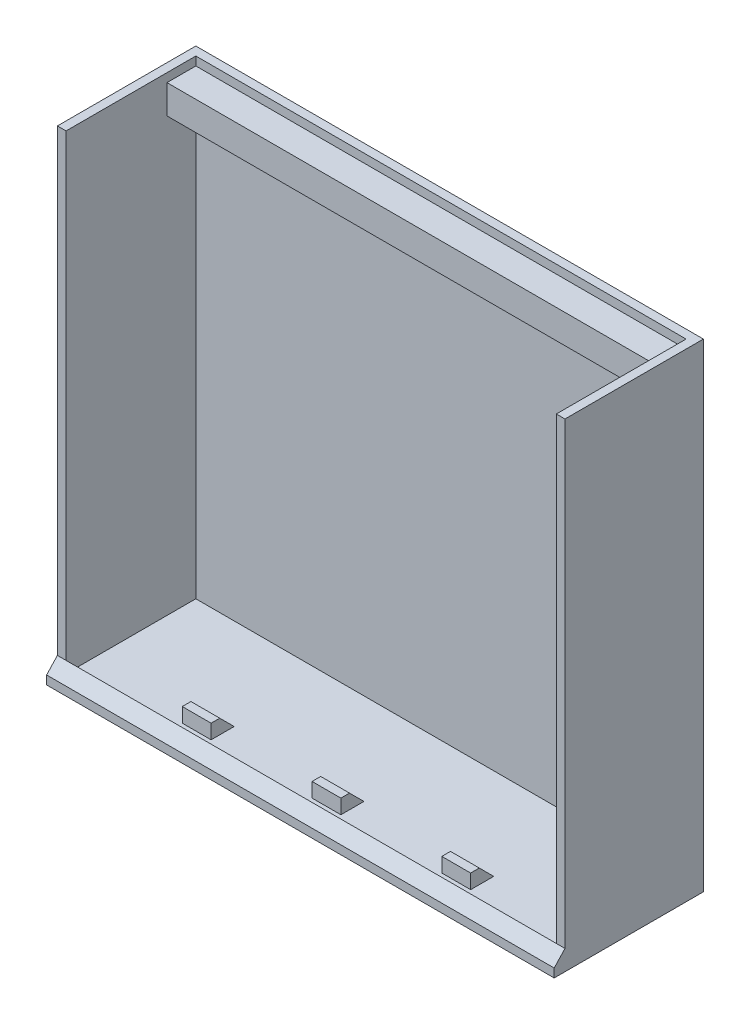
ISO-10303-21;
HEADER;
FILE_DESCRIPTION(('STEP AP214'),'2;1');
FILE_NAME('part.step','',(''),(''),'','','');
FILE_SCHEMA(('AUTOMOTIVE_DESIGN { 1 0 10303 214 1 1 1 1 }'));
ENDSEC;
DATA;
#1=APPLICATION_CONTEXT('core data for automotive mechanical design processes');
#2=APPLICATION_PROTOCOL_DEFINITION('international standard','automotive_design',2000,#1);
#3=PRODUCT_CONTEXT('',#1,'mechanical');
#4=PRODUCT('Part','Part','',(#3));
#5=PRODUCT_RELATED_PRODUCT_CATEGORY('part','',(#4));
#6=PRODUCT_DEFINITION_FORMATION('','',#4);
#7=PRODUCT_DEFINITION_CONTEXT('part definition',#1,'design');
#8=PRODUCT_DEFINITION('design','',#6,#7);
#9=PRODUCT_DEFINITION_SHAPE('','',#8);
#10=(LENGTH_UNIT() NAMED_UNIT(*) SI_UNIT(.MILLI.,.METRE.));
#11=(NAMED_UNIT(*) PLANE_ANGLE_UNIT() SI_UNIT($,.RADIAN.));
#12=(NAMED_UNIT(*) SI_UNIT($,.STERADIAN.) SOLID_ANGLE_UNIT());
#13=UNCERTAINTY_MEASURE_WITH_UNIT(LENGTH_MEASURE(1.E-05),#10,'distance_accuracy_value','');
#14=(GEOMETRIC_REPRESENTATION_CONTEXT(3) GLOBAL_UNCERTAINTY_ASSIGNED_CONTEXT((#13)) GLOBAL_UNIT_ASSIGNED_CONTEXT((#10,
#11,#12)) REPRESENTATION_CONTEXT('',''));
#15=CARTESIAN_POINT('',(0.,0.,0.));
#16=DIRECTION('',(0.,0.,1.));
#17=DIRECTION('',(1.,0.,0.));
#18=AXIS2_PLACEMENT_3D('',#15,#16,#17);
#19=CARTESIAN_POINT('',(-85.,0.,45.));
#20=DIRECTION('',(0.,0.,-1.));
#21=DIRECTION('',(-1.,0.,0.));
#22=AXIS2_PLACEMENT_3D('',#19,#20,#21);
#23=PLANE('',#22);
#24=DIRECTION('',(-1.,0.,0.));
#25=VECTOR('',#24,1.);
#26=CARTESIAN_POINT('',(88.,3.99999999999999,45.));
#27=LINE('',#26,#25);
#28=CARTESIAN_POINT('',(88.,3.99999999999999,45.));
#29=VERTEX_POINT('',#28);
#30=CARTESIAN_POINT('',(85.,3.99999999999999,45.));
#31=VERTEX_POINT('',#30);
#32=EDGE_CURVE('E243',#29,#31,#27,.T.);
#33=ORIENTED_EDGE('',*,*,#32,.F.);
#34=DIRECTION('',(0.,-1.,0.));
#35=VECTOR('',#34,1.);
#36=CARTESIAN_POINT('',(88.,0.,45.));
#37=LINE('',#36,#35);
#38=CARTESIAN_POINT('',(88.,163.,45.));
#39=VERTEX_POINT('',#38);
#40=EDGE_CURVE('E350',#39,#29,#37,.T.);
#41=ORIENTED_EDGE('',*,*,#40,.F.);
#42=DIRECTION('',(-1.,0.,0.));
#43=VECTOR('',#42,1.);
#44=CARTESIAN_POINT('',(88.,163.,45.));
#45=LINE('',#44,#43);
#46=CARTESIAN_POINT('',(85.,163.,45.));
#47=VERTEX_POINT('',#46);
#48=EDGE_CURVE('E356',#39,#47,#45,.T.);
#49=ORIENTED_EDGE('',*,*,#48,.T.);
#50=DIRECTION('',(0.,-1.,0.));
#51=VECTOR('',#50,1.);
#52=CARTESIAN_POINT('',(85.,0.,45.));
#53=LINE('',#52,#51);
#54=EDGE_CURVE('E348',#47,#31,#53,.T.);
#55=ORIENTED_EDGE('',*,*,#54,.T.);
#56=EDGE_LOOP('',(#33,#41,#49,#55));
#57=FACE_BOUND('',#56,.T.);
#58=ADVANCED_FACE('F37',(#57),#23,.F.);
#59=CARTESIAN_POINT('',(-85.,3.99999999999999,45.));
#60=VERTEX_POINT('',#59);
#61=CARTESIAN_POINT('',(-88.,3.99999999999999,45.));
#62=VERTEX_POINT('',#61);
#63=EDGE_CURVE('E220',#60,#62,#27,.T.);
#64=ORIENTED_EDGE('',*,*,#63,.F.);
#65=DIRECTION('',(0.,1.,0.));
#66=VECTOR('',#65,1.);
#67=CARTESIAN_POINT('',(-85.,0.,45.));
#68=LINE('',#67,#66);
#69=CARTESIAN_POINT('',(-85.,163.,45.));
#70=VERTEX_POINT('',#69);
#71=EDGE_CURVE('E372',#60,#70,#68,.T.);
#72=ORIENTED_EDGE('',*,*,#71,.T.);
#73=DIRECTION('',(1.,0.,0.));
#74=VECTOR('',#73,1.);
#75=CARTESIAN_POINT('',(-88.,163.,45.));
#76=LINE('',#75,#74);
#77=CARTESIAN_POINT('',(-88.,163.,45.));
#78=VERTEX_POINT('',#77);
#79=EDGE_CURVE('E223',#78,#70,#76,.T.);
#80=ORIENTED_EDGE('',*,*,#79,.F.);
#81=DIRECTION('',(0.,1.,0.));
#82=VECTOR('',#81,1.);
#83=CARTESIAN_POINT('',(-88.,0.,45.));
#84=LINE('',#83,#82);
#85=EDGE_CURVE('E217',#62,#78,#84,.T.);
#86=ORIENTED_EDGE('',*,*,#85,.F.);
#87=EDGE_LOOP('',(#64,#72,#80,#86));
#88=FACE_BOUND('',#87,.T.);
#89=ADVANCED_FACE('F219',(#88),#23,.F.);
#90=CARTESIAN_POINT('',(-85.,0.,0.));
#91=DIRECTION('',(0.,1.,0.));
#92=DIRECTION('',(0.,0.,1.));
#93=AXIS2_PLACEMENT_3D('',#90,#91,#92);
#94=PLANE('',#93);
#95=DIRECTION('',(1.,0.,0.));
#96=VECTOR('',#95,1.);
#97=CARTESIAN_POINT('',(-85.,0.,45.));
#98=LINE('',#97,#96);
#99=CARTESIAN_POINT('',(-85.,0.,45.));
#100=VERTEX_POINT('',#99);
#101=CARTESIAN_POINT('',(85.,0.,45.));
#102=VERTEX_POINT('',#101);
#103=EDGE_CURVE('E390',#100,#102,#98,.T.);
#104=ORIENTED_EDGE('',*,*,#103,.T.);
#105=DIRECTION('',(0.,0.,1.));
#106=VECTOR('',#105,1.);
#107=CARTESIAN_POINT('',(85.,0.,0.));
#108=LINE('',#107,#106);
#109=CARTESIAN_POINT('',(85.,0.,0.));
#110=VERTEX_POINT('',#109);
#111=EDGE_CURVE('E380',#110,#102,#108,.T.);
#112=ORIENTED_EDGE('',*,*,#111,.F.);
#113=DIRECTION('',(1.,0.,0.));
#114=VECTOR('',#113,1.);
#115=CARTESIAN_POINT('',(-85.,0.,0.));
#116=LINE('',#115,#114);
#117=CARTESIAN_POINT('',(-85.,0.,0.));
#118=VERTEX_POINT('',#117);
#119=EDGE_CURVE('E393',#118,#110,#116,.T.);
#120=ORIENTED_EDGE('',*,*,#119,.F.);
#121=DIRECTION('',(0.,0.,1.));
#122=VECTOR('',#121,1.);
#123=CARTESIAN_POINT('',(-85.,0.,0.));
#124=LINE('',#123,#122);
#125=EDGE_CURVE('E387',#118,#100,#124,.T.);
#126=ORIENTED_EDGE('',*,*,#125,.T.);
#127=EDGE_LOOP('',(#104,#112,#120,#126));
#128=FACE_BOUND('',#127,.T.);
#129=DIRECTION('',(0.,0.,1.));
#130=VECTOR('',#129,1.);
#131=CARTESIAN_POINT('',(-50.,0.,39.7));
#132=LINE('',#131,#130);
#133=CARTESIAN_POINT('',(-50.,0.,31.7));
#134=VERTEX_POINT('',#133);
#135=CARTESIAN_POINT('',(-50.,0.,39.7));
#136=VERTEX_POINT('',#135);
#137=EDGE_CURVE('E315',#134,#136,#132,.T.);
#138=ORIENTED_EDGE('',*,*,#137,.F.);
#139=DIRECTION('',(1.,0.,0.));
#140=VECTOR('',#139,1.);
#141=CARTESIAN_POINT('',(-85.,0.,31.7));
#142=LINE('',#141,#140);
#143=CARTESIAN_POINT('',(-40.,0.,31.7));
#144=VERTEX_POINT('',#143);
#145=EDGE_CURVE('E240',#134,#144,#142,.T.);
#146=ORIENTED_EDGE('',*,*,#145,.T.);
#147=DIRECTION('',(0.,0.,-1.));
#148=VECTOR('',#147,1.);
#149=CARTESIAN_POINT('',(-40.,0.,39.7));
#150=LINE('',#149,#148);
#151=CARTESIAN_POINT('',(-40.,0.,39.7));
#152=VERTEX_POINT('',#151);
#153=EDGE_CURVE('E301',#152,#144,#150,.T.);
#154=ORIENTED_EDGE('',*,*,#153,.F.);
#155=DIRECTION('',(1.,0.,0.));
#156=VECTOR('',#155,1.);
#157=CARTESIAN_POINT('',(-40.,0.,39.7));
#158=LINE('',#157,#156);
#159=EDGE_CURVE('E306',#136,#152,#158,.T.);
#160=ORIENTED_EDGE('',*,*,#159,.F.);
#161=EDGE_LOOP('',(#138,#146,#154,#160));
#162=FACE_BOUND('',#161,.T.);
#163=DIRECTION('',(0.,0.,1.));
#164=VECTOR('',#163,1.);
#165=CARTESIAN_POINT('',(40.,0.,36.7));
#166=LINE('',#165,#164);
#167=CARTESIAN_POINT('',(40.,0.,31.7));
#168=VERTEX_POINT('',#167);
#169=CARTESIAN_POINT('',(40.,0.,39.7));
#170=VERTEX_POINT('',#169);
#171=EDGE_CURVE('E293',#168,#170,#166,.T.);
#172=ORIENTED_EDGE('',*,*,#171,.F.);
#173=DIRECTION('',(1.,0.,0.));
#174=VECTOR('',#173,1.);
#175=CARTESIAN_POINT('',(-85.,0.,31.7));
#176=LINE('',#175,#174);
#177=CARTESIAN_POINT('',(50.,0.,31.7));
#178=VERTEX_POINT('',#177);
#179=EDGE_CURVE('E410',#168,#178,#176,.T.);
#180=ORIENTED_EDGE('',*,*,#179,.T.);
#181=DIRECTION('',(0.,0.,-1.));
#182=VECTOR('',#181,1.);
#183=CARTESIAN_POINT('',(50.,0.,36.7));
#184=LINE('',#183,#182);
#185=CARTESIAN_POINT('',(50.,0.,39.7));
#186=VERTEX_POINT('',#185);
#187=EDGE_CURVE('E279',#186,#178,#184,.T.);
#188=ORIENTED_EDGE('',*,*,#187,.F.);
#189=DIRECTION('',(1.,0.,0.));
#190=VECTOR('',#189,1.);
#191=CARTESIAN_POINT('',(50.,0.,39.7));
#192=LINE('',#191,#190);
#193=EDGE_CURVE('E284',#170,#186,#192,.T.);
#194=ORIENTED_EDGE('',*,*,#193,.F.);
#195=EDGE_LOOP('',(#172,#180,#188,#194));
#196=FACE_BOUND('',#195,.T.);
#197=DIRECTION('',(0.,0.,1.));
#198=VECTOR('',#197,1.);
#199=CARTESIAN_POINT('',(-5.,0.,39.7));
#200=LINE('',#199,#198);
#201=CARTESIAN_POINT('',(-5.,0.,31.7));
#202=VERTEX_POINT('',#201);
#203=CARTESIAN_POINT('',(-5.,0.,39.7));
#204=VERTEX_POINT('',#203);
#205=EDGE_CURVE('E53',#202,#204,#200,.T.);
#206=ORIENTED_EDGE('',*,*,#205,.F.);
#207=DIRECTION('',(1.,0.,0.));
#208=VECTOR('',#207,1.);
#209=CARTESIAN_POINT('',(-85.,0.,31.7));
#210=LINE('',#209,#208);
#211=CARTESIAN_POINT('',(5.,0.,31.7));
#212=VERTEX_POINT('',#211);
#213=EDGE_CURVE('E413',#202,#212,#210,.T.);
#214=ORIENTED_EDGE('',*,*,#213,.T.);
#215=DIRECTION('',(0.,0.,-1.));
#216=VECTOR('',#215,1.);
#217=CARTESIAN_POINT('',(5.,0.,39.7));
#218=LINE('',#217,#216);
#219=CARTESIAN_POINT('',(5.,0.,39.7));
#220=VERTEX_POINT('',#219);
#221=EDGE_CURVE('E61',#220,#212,#218,.T.);
#222=ORIENTED_EDGE('',*,*,#221,.F.);
#223=DIRECTION('',(1.,0.,0.));
#224=VECTOR('',#223,1.);
#225=CARTESIAN_POINT('',(5.,0.,39.7));
#226=LINE('',#225,#224);
#227=EDGE_CURVE('E265',#204,#220,#226,.T.);
#228=ORIENTED_EDGE('',*,*,#227,.F.);
#229=EDGE_LOOP('',(#206,#214,#222,#228));
#230=FACE_BOUND('',#229,.T.);
#231=ADVANCED_FACE('F435',(#128,#162,#196,#230),#94,.T.);
#232=CARTESIAN_POINT('',(-85.,0.,0.));
#233=DIRECTION('',(0.,0.,-1.));
#234=DIRECTION('',(-1.,0.,0.));
#235=AXIS2_PLACEMENT_3D('',#232,#233,#234);
#236=PLANE('',#235);
#237=DIRECTION('',(-1.,0.,0.));
#238=VECTOR('',#237,1.);
#239=CARTESIAN_POINT('',(88.,160.,0.));
#240=LINE('',#239,#238);
#241=CARTESIAN_POINT('',(85.,160.,0.));
#242=VERTEX_POINT('',#241);
#243=CARTESIAN_POINT('',(-85.,160.,0.));
#244=VERTEX_POINT('',#243);
#245=EDGE_CURVE('E323',#242,#244,#240,.T.);
#246=ORIENTED_EDGE('',*,*,#245,.F.);
#247=DIRECTION('',(0.,1.,0.));
#248=VECTOR('',#247,1.);
#249=CARTESIAN_POINT('',(85.,0.,0.));
#250=LINE('',#249,#248);
#251=CARTESIAN_POINT('',(85.,163.,0.));
#252=VERTEX_POINT('',#251);
#253=EDGE_CURVE('E376',#242,#252,#250,.T.);
#254=ORIENTED_EDGE('',*,*,#253,.T.);
#255=DIRECTION('',(1.,0.,0.));
#256=VECTOR('',#255,1.);
#257=CARTESIAN_POINT('',(-85.,163.,0.));
#258=LINE('',#257,#256);
#259=CARTESIAN_POINT('',(-85.,163.,0.));
#260=VERTEX_POINT('',#259);
#261=EDGE_CURVE('E395',#260,#252,#258,.T.);
#262=ORIENTED_EDGE('',*,*,#261,.F.);
#263=DIRECTION('',(0.,1.,0.));
#264=VECTOR('',#263,1.);
#265=CARTESIAN_POINT('',(-85.,0.,0.));
#266=LINE('',#265,#264);
#267=EDGE_CURVE('E383',#244,#260,#266,.T.);
#268=ORIENTED_EDGE('',*,*,#267,.F.);
#269=EDGE_LOOP('',(#246,#254,#262,#268));
#270=FACE_BOUND('',#269,.T.);
#271=ADVANCED_FACE('F576',(#270),#236,.F.);
#272=DIRECTION('',(-1.,0.,0.));
#273=VECTOR('',#272,1.);
#274=CARTESIAN_POINT('',(88.,140.,0.));
#275=LINE('',#274,#273);
#276=CARTESIAN_POINT('',(85.,140.,0.));
#277=VERTEX_POINT('',#276);
#278=CARTESIAN_POINT('',(-85.,140.,0.));
#279=VERTEX_POINT('',#278);
#280=EDGE_CURVE('E326',#277,#279,#275,.T.);
#281=ORIENTED_EDGE('',*,*,#280,.T.);
#282=EDGE_CURVE('E384',#118,#279,#266,.T.);
#283=ORIENTED_EDGE('',*,*,#282,.F.);
#284=ORIENTED_EDGE('',*,*,#119,.T.);
#285=EDGE_CURVE('E377',#110,#277,#250,.T.);
#286=ORIENTED_EDGE('',*,*,#285,.T.);
#287=EDGE_LOOP('',(#281,#283,#284,#286));
#288=FACE_BOUND('',#287,.T.);
#289=ADVANCED_FACE('F575',(#288),#236,.F.);
#290=CARTESIAN_POINT('',(-85.,0.,0.));
#291=DIRECTION('',(-1.,0.,0.));
#292=DIRECTION('',(0.,0.,1.));
#293=AXIS2_PLACEMENT_3D('',#290,#291,#292);
#294=PLANE('',#293);
#295=DIRECTION('',(0.,0.,1.));
#296=VECTOR('',#295,1.);
#297=CARTESIAN_POINT('',(-85.,160.,-4.44089209850063E-13));
#298=LINE('',#297,#296);
#299=CARTESIAN_POINT('',(-85.,160.,10.));
#300=VERTEX_POINT('',#299);
#301=EDGE_CURVE('E340',#244,#300,#298,.T.);
#302=ORIENTED_EDGE('',*,*,#301,.F.);
#303=ORIENTED_EDGE('',*,*,#267,.T.);
#304=DIRECTION('',(0.,0.,1.));
#305=VECTOR('',#304,1.);
#306=CARTESIAN_POINT('',(-85.,163.,0.));
#307=LINE('',#306,#305);
#308=EDGE_CURVE('E363',#260,#70,#307,.T.);
#309=ORIENTED_EDGE('',*,*,#308,.T.);
#310=ORIENTED_EDGE('',*,*,#71,.F.);
#311=EDGE_CURVE('E364',#100,#60,#68,.T.);
#312=ORIENTED_EDGE('',*,*,#311,.F.);
#313=ORIENTED_EDGE('',*,*,#125,.F.);
#314=ORIENTED_EDGE('',*,*,#282,.T.);
#315=DIRECTION('',(0.,-0.707106781186548,-0.707106781186547));
#316=VECTOR('',#315,1.);
#317=CARTESIAN_POINT('',(-85.,69.9999999999999,-70.));
#318=LINE('',#317,#316);
#319=CARTESIAN_POINT('',(-85.,150.,9.99999999999999));
#320=VERTEX_POINT('',#319);
#321=EDGE_CURVE('E334',#320,#279,#318,.T.);
#322=ORIENTED_EDGE('',*,*,#321,.F.);
#323=DIRECTION('',(0.,-1.,0.));
#324=VECTOR('',#323,1.);
#325=CARTESIAN_POINT('',(-85.,0.,9.99999999999997));
#326=LINE('',#325,#324);
#327=EDGE_CURVE('E337',#300,#320,#326,.T.);
#328=ORIENTED_EDGE('',*,*,#327,.F.);
#329=EDGE_LOOP('',(#302,#303,#309,#310,#312,#313,#314,#322,#328));
#330=FACE_BOUND('',#329,.T.);
#331=ADVANCED_FACE('F548',(#330),#294,.F.);
#332=CARTESIAN_POINT('',(85.,0.,0.));
#333=DIRECTION('',(1.,0.,0.));
#334=DIRECTION('',(0.,0.,-1.));
#335=AXIS2_PLACEMENT_3D('',#332,#333,#334);
#336=PLANE('',#335);
#337=DIRECTION('',(0.,0.,-1.));
#338=VECTOR('',#337,1.);
#339=CARTESIAN_POINT('',(85.,160.,-4.44089209850063E-13));
#340=LINE('',#339,#338);
#341=CARTESIAN_POINT('',(85.,160.,10.));
#342=VERTEX_POINT('',#341);
#343=EDGE_CURVE('E241',#342,#242,#340,.T.);
#344=ORIENTED_EDGE('',*,*,#343,.F.);
#345=DIRECTION('',(0.,1.,0.));
#346=VECTOR('',#345,1.);
#347=CARTESIAN_POINT('',(85.,0.,9.99999999999997));
#348=LINE('',#347,#346);
#349=CARTESIAN_POINT('',(85.,150.,10.));
#350=VERTEX_POINT('',#349);
#351=EDGE_CURVE('E403',#350,#342,#348,.T.);
#352=ORIENTED_EDGE('',*,*,#351,.F.);
#353=DIRECTION('',(0.,0.707106781186548,0.707106781186547));
#354=VECTOR('',#353,1.);
#355=CARTESIAN_POINT('',(85.,69.9999999999999,-70.));
#356=LINE('',#355,#354);
#357=EDGE_CURVE('E392',#277,#350,#356,.T.);
#358=ORIENTED_EDGE('',*,*,#357,.F.);
#359=ORIENTED_EDGE('',*,*,#285,.F.);
#360=ORIENTED_EDGE('',*,*,#111,.T.);
#361=EDGE_CURVE('E358',#31,#102,#53,.T.);
#362=ORIENTED_EDGE('',*,*,#361,.F.);
#363=ORIENTED_EDGE('',*,*,#54,.F.);
#364=DIRECTION('',(0.,0.,1.));
#365=VECTOR('',#364,1.);
#366=CARTESIAN_POINT('',(85.,163.,0.));
#367=LINE('',#366,#365);
#368=EDGE_CURVE('E343',#252,#47,#367,.T.);
#369=ORIENTED_EDGE('',*,*,#368,.F.);
#370=ORIENTED_EDGE('',*,*,#253,.F.);
#371=EDGE_LOOP('',(#344,#352,#358,#359,#360,#362,#363,#369,#370));
#372=FACE_BOUND('',#371,.T.);
#373=ADVANCED_FACE('F561',(#372),#336,.F.);
#374=CARTESIAN_POINT('',(-85.,163.,0.));
#375=DIRECTION('',(0.,-1.,0.));
#376=DIRECTION('',(0.,0.,-1.));
#377=AXIS2_PLACEMENT_3D('',#374,#375,#376);
#378=PLANE('',#377);
#379=ORIENTED_EDGE('',*,*,#261,.T.);
#380=ORIENTED_EDGE('',*,*,#368,.T.);
#381=ORIENTED_EDGE('',*,*,#48,.F.);
#382=DIRECTION('',(0.,0.,1.));
#383=VECTOR('',#382,1.);
#384=CARTESIAN_POINT('',(88.,163.,0.));
#385=LINE('',#384,#383);
#386=CARTESIAN_POINT('',(88.,163.,-3.));
#387=VERTEX_POINT('',#386);
#388=EDGE_CURVE('E347',#387,#39,#385,.T.);
#389=ORIENTED_EDGE('',*,*,#388,.F.);
#390=DIRECTION('',(1.,0.,0.));
#391=VECTOR('',#390,1.);
#392=CARTESIAN_POINT('',(-85.,163.,-3.));
#393=LINE('',#392,#391);
#394=CARTESIAN_POINT('',(-88.,163.,-3.));
#395=VERTEX_POINT('',#394);
#396=EDGE_CURVE('E398',#395,#387,#393,.T.);
#397=ORIENTED_EDGE('',*,*,#396,.F.);
#398=DIRECTION('',(0.,0.,1.));
#399=VECTOR('',#398,1.);
#400=CARTESIAN_POINT('',(-88.,163.,0.));
#401=LINE('',#400,#399);
#402=EDGE_CURVE('E229',#395,#78,#401,.T.);
#403=ORIENTED_EDGE('',*,*,#402,.T.);
#404=ORIENTED_EDGE('',*,*,#79,.T.);
#405=ORIENTED_EDGE('',*,*,#308,.F.);
#406=EDGE_LOOP('',(#379,#380,#381,#389,#397,#403,#404,#405));
#407=FACE_BOUND('',#406,.T.);
#408=ADVANCED_FACE('F553',(#407),#378,.F.);
#409=CARTESIAN_POINT('',(-85.,0.,-3.00000000000002));
#410=DIRECTION('',(0.,0.,1.));
#411=DIRECTION('',(0.,-1.,0.));
#412=AXIS2_PLACEMENT_3D('',#409,#410,#411);
#413=PLANE('',#412);
#414=ORIENTED_EDGE('',*,*,#396,.T.);
#415=DIRECTION('',(0.,1.,0.));
#416=VECTOR('',#415,1.);
#417=CARTESIAN_POINT('',(88.,0.,-3.00000000000002));
#418=LINE('',#417,#416);
#419=CARTESIAN_POINT('',(88.,-3.,-3.00000000000002));
#420=VERTEX_POINT('',#419);
#421=EDGE_CURVE('E344',#420,#387,#418,.T.);
#422=ORIENTED_EDGE('',*,*,#421,.F.);
#423=DIRECTION('',(1.,0.,0.));
#424=VECTOR('',#423,1.);
#425=CARTESIAN_POINT('',(-85.,-3.,-3.00000000000002));
#426=LINE('',#425,#424);
#427=CARTESIAN_POINT('',(-88.,-3.,-3.00000000000002));
#428=VERTEX_POINT('',#427);
#429=EDGE_CURVE('E389',#428,#420,#426,.T.);
#430=ORIENTED_EDGE('',*,*,#429,.F.);
#431=DIRECTION('',(0.,-1.,0.));
#432=VECTOR('',#431,1.);
#433=CARTESIAN_POINT('',(-88.,0.,-3.00000000000002));
#434=LINE('',#433,#432);
#435=EDGE_CURVE('E367',#395,#428,#434,.T.);
#436=ORIENTED_EDGE('',*,*,#435,.F.);
#437=EDGE_LOOP('',(#414,#422,#430,#436));
#438=FACE_BOUND('',#437,.T.);
#439=ADVANCED_FACE('F559',(#438),#413,.F.);
#440=CARTESIAN_POINT('',(-85.,-3.,0.));
#441=DIRECTION('',(0.,1.,0.));
#442=DIRECTION('',(0.,0.,1.));
#443=AXIS2_PLACEMENT_3D('',#440,#441,#442);
#444=PLANE('',#443);
#445=ORIENTED_EDGE('',*,*,#429,.T.);
#446=DIRECTION('',(0.,0.,-1.));
#447=VECTOR('',#446,1.);
#448=CARTESIAN_POINT('',(88.,-3.,0.));
#449=LINE('',#448,#447);
#450=CARTESIAN_POINT('',(88.,-3.00000000000001,48.7425732673633));
#451=VERTEX_POINT('',#450);
#452=EDGE_CURVE('E353',#451,#420,#449,.T.);
#453=ORIENTED_EDGE('',*,*,#452,.F.);
#454=DIRECTION('',(-1.,0.,0.));
#455=VECTOR('',#454,1.);
#456=CARTESIAN_POINT('',(88.,-3.00000000000001,48.7425732673633));
#457=LINE('',#456,#455);
#458=CARTESIAN_POINT('',(-88.,-3.00000000000001,48.7425732673633));
#459=VERTEX_POINT('',#458);
#460=EDGE_CURVE('E256',#451,#459,#457,.T.);
#461=ORIENTED_EDGE('',*,*,#460,.T.);
#462=DIRECTION('',(0.,0.,1.));
#463=VECTOR('',#462,1.);
#464=CARTESIAN_POINT('',(-88.,-3.,0.));
#465=LINE('',#464,#463);
#466=EDGE_CURVE('E228',#428,#459,#465,.T.);
#467=ORIENTED_EDGE('',*,*,#466,.F.);
#468=EDGE_LOOP('',(#445,#453,#461,#467));
#469=FACE_BOUND('',#468,.T.);
#470=ADVANCED_FACE('F465',(#469),#444,.F.);
#471=CARTESIAN_POINT('',(-88.,0.,0.));
#472=DIRECTION('',(-1.,0.,0.));
#473=DIRECTION('',(0.,0.,1.));
#474=AXIS2_PLACEMENT_3D('',#471,#472,#473);
#475=PLANE('',#474);
#476=ORIENTED_EDGE('',*,*,#402,.F.);
#477=ORIENTED_EDGE('',*,*,#435,.T.);
#478=ORIENTED_EDGE('',*,*,#466,.T.);
#479=DIRECTION('',(0.,-1.,0.));
#480=VECTOR('',#479,1.);
#481=CARTESIAN_POINT('',(-88.,-3.00000000000001,48.7425732673633));
#482=LINE('',#481,#480);
#483=CARTESIAN_POINT('',(-88.,0.,48.7425732673633));
#484=VERTEX_POINT('',#483);
#485=EDGE_CURVE('E247',#484,#459,#482,.T.);
#486=ORIENTED_EDGE('',*,*,#485,.F.);
#487=DIRECTION('',(0.,-0.730213325351157,0.683219217732936));
#488=VECTOR('',#487,1.);
#489=CARTESIAN_POINT('',(-88.,0.,48.7425732673633));
#490=LINE('',#489,#488);
#491=EDGE_CURVE('E237',#62,#484,#490,.T.);
#492=ORIENTED_EDGE('',*,*,#491,.F.);
#493=ORIENTED_EDGE('',*,*,#85,.T.);
#494=EDGE_LOOP('',(#476,#477,#478,#486,#492,#493));
#495=FACE_BOUND('',#494,.T.);
#496=ADVANCED_FACE('F245',(#495),#475,.T.);
#497=CARTESIAN_POINT('',(88.,0.,0.));
#498=DIRECTION('',(1.,0.,0.));
#499=DIRECTION('',(0.,0.,-1.));
#500=AXIS2_PLACEMENT_3D('',#497,#498,#499);
#501=PLANE('',#500);
#502=ORIENTED_EDGE('',*,*,#421,.T.);
#503=ORIENTED_EDGE('',*,*,#388,.T.);
#504=ORIENTED_EDGE('',*,*,#40,.T.);
#505=DIRECTION('',(0.,-0.730213325351157,0.683219217732936));
#506=VECTOR('',#505,1.);
#507=CARTESIAN_POINT('',(88.,0.,48.7425732673633));
#508=LINE('',#507,#506);
#509=CARTESIAN_POINT('',(88.,0.,48.7425732673633));
#510=VERTEX_POINT('',#509);
#511=EDGE_CURVE('E249',#29,#510,#508,.T.);
#512=ORIENTED_EDGE('',*,*,#511,.T.);
#513=DIRECTION('',(0.,-1.,0.));
#514=VECTOR('',#513,1.);
#515=CARTESIAN_POINT('',(88.,-3.00000000000001,48.7425732673633));
#516=LINE('',#515,#514);
#517=EDGE_CURVE('E253',#510,#451,#516,.T.);
#518=ORIENTED_EDGE('',*,*,#517,.T.);
#519=ORIENTED_EDGE('',*,*,#452,.T.);
#520=EDGE_LOOP('',(#502,#503,#504,#512,#518,#519));
#521=FACE_BOUND('',#520,.T.);
#522=ADVANCED_FACE('F536',(#521),#501,.T.);
#523=CARTESIAN_POINT('',(88.,160.,10.));
#524=DIRECTION('',(0.,-1.,0.));
#525=DIRECTION('',(0.,0.,-1.));
#526=AXIS2_PLACEMENT_3D('',#523,#524,#525);
#527=PLANE('',#526);
#528=ORIENTED_EDGE('',*,*,#245,.T.);
#529=ORIENTED_EDGE('',*,*,#301,.T.);
#530=DIRECTION('',(-1.,0.,0.));
#531=VECTOR('',#530,1.);
#532=CARTESIAN_POINT('',(88.,160.,10.));
#533=LINE('',#532,#531);
#534=EDGE_CURVE('E331',#342,#300,#533,.T.);
#535=ORIENTED_EDGE('',*,*,#534,.F.);
#536=ORIENTED_EDGE('',*,*,#343,.T.);
#537=EDGE_LOOP('',(#528,#529,#535,#536));
#538=FACE_BOUND('',#537,.T.);
#539=ADVANCED_FACE('F565',(#538),#527,.F.);
#540=CARTESIAN_POINT('',(88.,160.,10.));
#541=DIRECTION('',(0.,0.,-1.));
#542=DIRECTION('',(0.,1.,0.));
#543=AXIS2_PLACEMENT_3D('',#540,#541,#542);
#544=PLANE('',#543);
#545=ORIENTED_EDGE('',*,*,#534,.T.);
#546=ORIENTED_EDGE('',*,*,#327,.T.);
#547=DIRECTION('',(-1.,0.,0.));
#548=VECTOR('',#547,1.);
#549=CARTESIAN_POINT('',(88.,150.,10.));
#550=LINE('',#549,#548);
#551=EDGE_CURVE('E328',#350,#320,#550,.T.);
#552=ORIENTED_EDGE('',*,*,#551,.F.);
#553=ORIENTED_EDGE('',*,*,#351,.T.);
#554=EDGE_LOOP('',(#545,#546,#552,#553));
#555=FACE_BOUND('',#554,.T.);
#556=ADVANCED_FACE('F567',(#555),#544,.F.);
#557=CARTESIAN_POINT('',(88.,150.,10.));
#558=DIRECTION('',(0.,0.707106781186547,-0.707106781186548));
#559=DIRECTION('',(0.,0.707106781186548,0.707106781186547));
#560=AXIS2_PLACEMENT_3D('',#557,#558,#559);
#561=PLANE('',#560);
#562=ORIENTED_EDGE('',*,*,#551,.T.);
#563=ORIENTED_EDGE('',*,*,#321,.T.);
#564=ORIENTED_EDGE('',*,*,#280,.F.);
#565=ORIENTED_EDGE('',*,*,#357,.T.);
#566=EDGE_LOOP('',(#562,#563,#564,#565));
#567=FACE_BOUND('',#566,.T.);
#568=ADVANCED_FACE('F572',(#567),#561,.F.);
#569=CARTESIAN_POINT('',(-40.,4.99999999999999,39.7));
#570=DIRECTION('',(-1.,0.,0.));
#571=DIRECTION('',(0.,0.,1.));
#572=AXIS2_PLACEMENT_3D('',#569,#570,#571);
#573=PLANE('',#572);
#574=ORIENTED_EDGE('',*,*,#153,.T.);
#575=DIRECTION('',(0.,0.707106781186549,0.707106781186546));
#576=VECTOR('',#575,1.);
#577=CARTESIAN_POINT('',(-40.,6.5,38.2));
#578=LINE('',#577,#576);
#579=CARTESIAN_POINT('',(-40.,4.99999999999999,36.7));
#580=VERTEX_POINT('',#579);
#581=EDGE_CURVE('E11',#144,#580,#578,.T.);
#582=ORIENTED_EDGE('',*,*,#581,.T.);
#583=DIRECTION('',(0.,0.,-1.));
#584=VECTOR('',#583,1.);
#585=CARTESIAN_POINT('',(-40.,4.99999999999999,39.7));
#586=LINE('',#585,#584);
#587=CARTESIAN_POINT('',(-40.,4.99999999999999,39.7));
#588=VERTEX_POINT('',#587);
#589=EDGE_CURVE('E302',#588,#580,#586,.T.);
#590=ORIENTED_EDGE('',*,*,#589,.F.);
#591=DIRECTION('',(0.,-1.,0.));
#592=VECTOR('',#591,1.);
#593=CARTESIAN_POINT('',(-40.,4.99999999999999,39.7));
#594=LINE('',#593,#592);
#595=EDGE_CURVE('E313',#588,#152,#594,.T.);
#596=ORIENTED_EDGE('',*,*,#595,.T.);
#597=EDGE_LOOP('',(#574,#582,#590,#596));
#598=FACE_BOUND('',#597,.T.);
#599=ADVANCED_FACE('F443',(#598),#573,.F.);
#600=CARTESIAN_POINT('',(-50.,4.99999999999999,39.7));
#601=DIRECTION('',(1.,0.,0.));
#602=DIRECTION('',(0.,0.,-1.));
#603=AXIS2_PLACEMENT_3D('',#600,#601,#602);
#604=PLANE('',#603);
#605=ORIENTED_EDGE('',*,*,#137,.T.);
#606=DIRECTION('',(0.,-1.,0.));
#607=VECTOR('',#606,1.);
#608=CARTESIAN_POINT('',(-50.,4.99999999999999,39.7));
#609=LINE('',#608,#607);
#610=CARTESIAN_POINT('',(-50.,4.99999999999999,39.7));
#611=VERTEX_POINT('',#610);
#612=EDGE_CURVE('E321',#611,#136,#609,.T.);
#613=ORIENTED_EDGE('',*,*,#612,.F.);
#614=DIRECTION('',(0.,0.,1.));
#615=VECTOR('',#614,1.);
#616=CARTESIAN_POINT('',(-50.,4.99999999999999,39.7));
#617=LINE('',#616,#615);
#618=CARTESIAN_POINT('',(-50.,4.99999999999999,36.7));
#619=VERTEX_POINT('',#618);
#620=EDGE_CURVE('E309',#619,#611,#617,.T.);
#621=ORIENTED_EDGE('',*,*,#620,.F.);
#622=DIRECTION('',(0.,-0.707106781186549,-0.707106781186546));
#623=VECTOR('',#622,1.);
#624=CARTESIAN_POINT('',(-50.,6.5,38.2));
#625=LINE('',#624,#623);
#626=EDGE_CURVE('E46',#619,#134,#625,.T.);
#627=ORIENTED_EDGE('',*,*,#626,.T.);
#628=EDGE_LOOP('',(#605,#613,#621,#627));
#629=FACE_BOUND('',#628,.T.);
#630=ADVANCED_FACE('F427',(#629),#604,.F.);
#631=CARTESIAN_POINT('',(-40.,4.99999999999999,39.7));
#632=DIRECTION('',(0.,0.,-1.));
#633=DIRECTION('',(0.,1.,0.));
#634=AXIS2_PLACEMENT_3D('',#631,#632,#633);
#635=PLANE('',#634);
#636=ORIENTED_EDGE('',*,*,#159,.T.);
#637=ORIENTED_EDGE('',*,*,#595,.F.);
#638=DIRECTION('',(1.,0.,0.));
#639=VECTOR('',#638,1.);
#640=CARTESIAN_POINT('',(-40.,4.99999999999999,39.7));
#641=LINE('',#640,#639);
#642=EDGE_CURVE('E311',#611,#588,#641,.T.);
#643=ORIENTED_EDGE('',*,*,#642,.F.);
#644=ORIENTED_EDGE('',*,*,#612,.T.);
#645=EDGE_LOOP('',(#636,#637,#643,#644));
#646=FACE_BOUND('',#645,.T.);
#647=ADVANCED_FACE('F439',(#646),#635,.F.);
#648=CARTESIAN_POINT('',(0.,5.,0.));
#649=DIRECTION('',(0.,1.,0.));
#650=DIRECTION('',(0.,0.,1.));
#651=AXIS2_PLACEMENT_3D('',#648,#649,#650);
#652=PLANE('',#651);
#653=ORIENTED_EDGE('',*,*,#589,.T.);
#654=DIRECTION('',(-1.,0.,0.));
#655=VECTOR('',#654,1.);
#656=CARTESIAN_POINT('',(-40.,4.99999999999999,36.7));
#657=LINE('',#656,#655);
#658=EDGE_CURVE('E305',#580,#619,#657,.T.);
#659=ORIENTED_EDGE('',*,*,#658,.T.);
#660=ORIENTED_EDGE('',*,*,#620,.T.);
#661=ORIENTED_EDGE('',*,*,#642,.T.);
#662=EDGE_LOOP('',(#653,#659,#660,#661));
#663=FACE_BOUND('',#662,.T.);
#664=ADVANCED_FACE('F445',(#663),#652,.T.);
#665=CARTESIAN_POINT('',(50.,4.99999999999999,36.7));
#666=DIRECTION('',(-1.,0.,0.));
#667=DIRECTION('',(0.,0.,1.));
#668=AXIS2_PLACEMENT_3D('',#665,#666,#667);
#669=PLANE('',#668);
#670=ORIENTED_EDGE('',*,*,#187,.T.);
#671=DIRECTION('',(0.,0.707106781186549,0.707106781186546));
#672=VECTOR('',#671,1.);
#673=CARTESIAN_POINT('',(50.,4.99999999999999,36.7));
#674=LINE('',#673,#672);
#675=CARTESIAN_POINT('',(50.,4.99999999999999,36.7));
#676=VERTEX_POINT('',#675);
#677=EDGE_CURVE('E422',#178,#676,#674,.T.);
#678=ORIENTED_EDGE('',*,*,#677,.T.);
#679=DIRECTION('',(0.,0.,-1.));
#680=VECTOR('',#679,1.);
#681=CARTESIAN_POINT('',(50.,4.99999999999999,36.7));
#682=LINE('',#681,#680);
#683=CARTESIAN_POINT('',(50.,4.99999999999999,39.7));
#684=VERTEX_POINT('',#683);
#685=EDGE_CURVE('E280',#684,#676,#682,.T.);
#686=ORIENTED_EDGE('',*,*,#685,.F.);
#687=DIRECTION('',(0.,-1.,0.));
#688=VECTOR('',#687,1.);
#689=CARTESIAN_POINT('',(50.,4.99999999999999,39.7));
#690=LINE('',#689,#688);
#691=EDGE_CURVE('E291',#684,#186,#690,.T.);
#692=ORIENTED_EDGE('',*,*,#691,.T.);
#693=EDGE_LOOP('',(#670,#678,#686,#692));
#694=FACE_BOUND('',#693,.T.);
#695=ADVANCED_FACE('F447',(#694),#669,.F.);
#696=CARTESIAN_POINT('',(40.,4.99999999999999,36.7));
#697=DIRECTION('',(1.,0.,0.));
#698=DIRECTION('',(0.,0.,-1.));
#699=AXIS2_PLACEMENT_3D('',#696,#697,#698);
#700=PLANE('',#699);
#701=ORIENTED_EDGE('',*,*,#171,.T.);
#702=DIRECTION('',(0.,-1.,0.));
#703=VECTOR('',#702,1.);
#704=CARTESIAN_POINT('',(40.,4.99999999999999,39.7));
#705=LINE('',#704,#703);
#706=CARTESIAN_POINT('',(40.,4.99999999999999,39.7));
#707=VERTEX_POINT('',#706);
#708=EDGE_CURVE('E299',#707,#170,#705,.T.);
#709=ORIENTED_EDGE('',*,*,#708,.F.);
#710=DIRECTION('',(0.,0.,1.));
#711=VECTOR('',#710,1.);
#712=CARTESIAN_POINT('',(40.,4.99999999999999,36.7));
#713=LINE('',#712,#711);
#714=CARTESIAN_POINT('',(40.,4.99999999999999,36.7));
#715=VERTEX_POINT('',#714);
#716=EDGE_CURVE('E287',#715,#707,#713,.T.);
#717=ORIENTED_EDGE('',*,*,#716,.F.);
#718=DIRECTION('',(0.,-0.707106781186549,-0.707106781186546));
#719=VECTOR('',#718,1.);
#720=CARTESIAN_POINT('',(40.,4.99999999999999,36.7));
#721=LINE('',#720,#719);
#722=EDGE_CURVE('E419',#715,#168,#721,.T.);
#723=ORIENTED_EDGE('',*,*,#722,.T.);
#724=EDGE_LOOP('',(#701,#709,#717,#723));
#725=FACE_BOUND('',#724,.T.);
#726=ADVANCED_FACE('F453',(#725),#700,.F.);
#727=CARTESIAN_POINT('',(50.,4.99999999999999,39.7));
#728=DIRECTION('',(0.,0.,-1.));
#729=DIRECTION('',(0.,1.,0.));
#730=AXIS2_PLACEMENT_3D('',#727,#728,#729);
#731=PLANE('',#730);
#732=ORIENTED_EDGE('',*,*,#193,.T.);
#733=ORIENTED_EDGE('',*,*,#691,.F.);
#734=DIRECTION('',(1.,0.,0.));
#735=VECTOR('',#734,1.);
#736=CARTESIAN_POINT('',(50.,4.99999999999999,39.7));
#737=LINE('',#736,#735);
#738=EDGE_CURVE('E289',#707,#684,#737,.T.);
#739=ORIENTED_EDGE('',*,*,#738,.F.);
#740=ORIENTED_EDGE('',*,*,#708,.T.);
#741=EDGE_LOOP('',(#732,#733,#739,#740));
#742=FACE_BOUND('',#741,.T.);
#743=ADVANCED_FACE('F495',(#742),#731,.F.);
#744=CARTESIAN_POINT('',(0.,5.,0.));
#745=DIRECTION('',(0.,-1.,0.));
#746=DIRECTION('',(0.,0.,-1.));
#747=AXIS2_PLACEMENT_3D('',#744,#745,#746);
#748=PLANE('',#747);
#749=ORIENTED_EDGE('',*,*,#685,.T.);
#750=DIRECTION('',(-1.,0.,0.));
#751=VECTOR('',#750,1.);
#752=CARTESIAN_POINT('',(50.,4.99999999999999,36.7));
#753=LINE('',#752,#751);
#754=EDGE_CURVE('E283',#676,#715,#753,.T.);
#755=ORIENTED_EDGE('',*,*,#754,.T.);
#756=ORIENTED_EDGE('',*,*,#716,.T.);
#757=ORIENTED_EDGE('',*,*,#738,.T.);
#758=EDGE_LOOP('',(#749,#755,#756,#757));
#759=FACE_BOUND('',#758,.T.);
#760=ADVANCED_FACE('F489',(#759),#748,.F.);
#761=CARTESIAN_POINT('',(5.,4.99999999999999,39.7));
#762=DIRECTION('',(-1.,0.,0.));
#763=DIRECTION('',(0.,0.,1.));
#764=AXIS2_PLACEMENT_3D('',#761,#762,#763);
#765=PLANE('',#764);
#766=ORIENTED_EDGE('',*,*,#221,.T.);
#767=DIRECTION('',(0.,0.707106781186549,0.707106781186546));
#768=VECTOR('',#767,1.);
#769=CARTESIAN_POINT('',(5.,6.5,38.2));
#770=LINE('',#769,#768);
#771=CARTESIAN_POINT('',(5.,4.99999999999999,36.7));
#772=VERTEX_POINT('',#771);
#773=EDGE_CURVE('E417',#212,#772,#770,.T.);
#774=ORIENTED_EDGE('',*,*,#773,.T.);
#775=DIRECTION('',(0.,0.,-1.));
#776=VECTOR('',#775,1.);
#777=CARTESIAN_POINT('',(5.,4.99999999999999,39.7));
#778=LINE('',#777,#776);
#779=CARTESIAN_POINT('',(5.,4.99999999999999,39.7));
#780=VERTEX_POINT('',#779);
#781=EDGE_CURVE('E261',#780,#772,#778,.T.);
#782=ORIENTED_EDGE('',*,*,#781,.F.);
#783=DIRECTION('',(0.,-1.,0.));
#784=VECTOR('',#783,1.);
#785=CARTESIAN_POINT('',(5.,4.99999999999999,39.7));
#786=LINE('',#785,#784);
#787=EDGE_CURVE('E272',#780,#220,#786,.T.);
#788=ORIENTED_EDGE('',*,*,#787,.T.);
#789=EDGE_LOOP('',(#766,#774,#782,#788));
#790=FACE_BOUND('',#789,.T.);
#791=ADVANCED_FACE('F507',(#790),#765,.F.);
#792=CARTESIAN_POINT('',(-5.,4.99999999999999,39.7));
#793=DIRECTION('',(1.,0.,0.));
#794=DIRECTION('',(0.,0.,-1.));
#795=AXIS2_PLACEMENT_3D('',#792,#793,#794);
#796=PLANE('',#795);
#797=ORIENTED_EDGE('',*,*,#205,.T.);
#798=DIRECTION('',(0.,-1.,0.));
#799=VECTOR('',#798,1.);
#800=CARTESIAN_POINT('',(-5.,4.99999999999999,39.7));
#801=LINE('',#800,#799);
#802=CARTESIAN_POINT('',(-5.,4.99999999999999,39.7));
#803=VERTEX_POINT('',#802);
#804=EDGE_CURVE('E277',#803,#204,#801,.T.);
#805=ORIENTED_EDGE('',*,*,#804,.F.);
#806=DIRECTION('',(0.,0.,1.));
#807=VECTOR('',#806,1.);
#808=CARTESIAN_POINT('',(-5.,4.99999999999999,39.7));
#809=LINE('',#808,#807);
#810=CARTESIAN_POINT('',(-5.,4.99999999999999,36.7));
#811=VERTEX_POINT('',#810);
#812=EDGE_CURVE('E268',#811,#803,#809,.T.);
#813=ORIENTED_EDGE('',*,*,#812,.F.);
#814=DIRECTION('',(0.,-0.707106781186549,-0.707106781186546));
#815=VECTOR('',#814,1.);
#816=CARTESIAN_POINT('',(-5.,6.5,38.2));
#817=LINE('',#816,#815);
#818=EDGE_CURVE('E415',#811,#202,#817,.T.);
#819=ORIENTED_EDGE('',*,*,#818,.T.);
#820=EDGE_LOOP('',(#797,#805,#813,#819));
#821=FACE_BOUND('',#820,.T.);
#822=ADVANCED_FACE('F510',(#821),#796,.F.);
#823=CARTESIAN_POINT('',(5.,4.99999999999999,39.7));
#824=DIRECTION('',(0.,0.,-1.));
#825=DIRECTION('',(0.,1.,0.));
#826=AXIS2_PLACEMENT_3D('',#823,#824,#825);
#827=PLANE('',#826);
#828=ORIENTED_EDGE('',*,*,#227,.T.);
#829=ORIENTED_EDGE('',*,*,#787,.F.);
#830=DIRECTION('',(1.,0.,0.));
#831=VECTOR('',#830,1.);
#832=CARTESIAN_POINT('',(5.,4.99999999999999,39.7));
#833=LINE('',#832,#831);
#834=EDGE_CURVE('E270',#803,#780,#833,.T.);
#835=ORIENTED_EDGE('',*,*,#834,.F.);
#836=ORIENTED_EDGE('',*,*,#804,.T.);
#837=EDGE_LOOP('',(#828,#829,#835,#836));
#838=FACE_BOUND('',#837,.T.);
#839=ADVANCED_FACE('F513',(#838),#827,.F.);
#840=CARTESIAN_POINT('',(0.,5.,0.));
#841=DIRECTION('',(0.,1.,0.));
#842=DIRECTION('',(0.,0.,1.));
#843=AXIS2_PLACEMENT_3D('',#840,#841,#842);
#844=PLANE('',#843);
#845=ORIENTED_EDGE('',*,*,#781,.T.);
#846=DIRECTION('',(-1.,0.,0.));
#847=VECTOR('',#846,1.);
#848=CARTESIAN_POINT('',(5.,4.99999999999999,36.7));
#849=LINE('',#848,#847);
#850=EDGE_CURVE('E264',#772,#811,#849,.T.);
#851=ORIENTED_EDGE('',*,*,#850,.T.);
#852=ORIENTED_EDGE('',*,*,#812,.T.);
#853=ORIENTED_EDGE('',*,*,#834,.T.);
#854=EDGE_LOOP('',(#845,#851,#852,#853));
#855=FACE_BOUND('',#854,.T.);
#856=ADVANCED_FACE('F517',(#855),#844,.T.);
#857=CARTESIAN_POINT('',(88.,3.99999999999999,45.));
#858=DIRECTION('',(0.,0.,1.));
#859=DIRECTION('',(1.,0.,0.));
#860=AXIS2_PLACEMENT_3D('',#857,#858,#859);
#861=PLANE('',#860);
#862=EDGE_CURVE('E239',#31,#60,#27,.T.);
#863=ORIENTED_EDGE('',*,*,#862,.F.);
#864=ORIENTED_EDGE('',*,*,#361,.T.);
#865=ORIENTED_EDGE('',*,*,#103,.F.);
#866=ORIENTED_EDGE('',*,*,#311,.T.);
#867=EDGE_LOOP('',(#863,#864,#865,#866));
#868=FACE_BOUND('',#867,.T.);
#869=ADVANCED_FACE('F521',(#868),#861,.F.);
#870=CARTESIAN_POINT('',(88.,0.,48.7425732673633));
#871=DIRECTION('',(0.,-0.683219217732936,-0.730213325351157));
#872=DIRECTION('',(0.,0.730213325351157,-0.683219217732936));
#873=AXIS2_PLACEMENT_3D('',#870,#871,#872);
#874=PLANE('',#873);
#875=ORIENTED_EDGE('',*,*,#32,.T.);
#876=ORIENTED_EDGE('',*,*,#862,.T.);
#877=ORIENTED_EDGE('',*,*,#63,.T.);
#878=ORIENTED_EDGE('',*,*,#491,.T.);
#879=DIRECTION('',(-1.,0.,0.));
#880=VECTOR('',#879,1.);
#881=CARTESIAN_POINT('',(88.,0.,48.7425732673633));
#882=LINE('',#881,#880);
#883=EDGE_CURVE('E259',#510,#484,#882,.T.);
#884=ORIENTED_EDGE('',*,*,#883,.F.);
#885=ORIENTED_EDGE('',*,*,#511,.F.);
#886=EDGE_LOOP('',(#875,#876,#877,#878,#884,#885));
#887=FACE_BOUND('',#886,.T.);
#888=ADVANCED_FACE('F235',(#887),#874,.F.);
#889=CARTESIAN_POINT('',(88.,-3.00000000000001,48.7425732673633));
#890=DIRECTION('',(0.,0.,-1.));
#891=DIRECTION('',(-1.,0.,0.));
#892=AXIS2_PLACEMENT_3D('',#889,#890,#891);
#893=PLANE('',#892);
#894=ORIENTED_EDGE('',*,*,#883,.T.);
#895=ORIENTED_EDGE('',*,*,#485,.T.);
#896=ORIENTED_EDGE('',*,*,#460,.F.);
#897=ORIENTED_EDGE('',*,*,#517,.F.);
#898=EDGE_LOOP('',(#894,#895,#896,#897));
#899=FACE_BOUND('',#898,.T.);
#900=ADVANCED_FACE('F474',(#899),#893,.F.);
#901=CARTESIAN_POINT('',(5.,4.99999999999999,36.7));
#902=DIRECTION('',(0.,-0.707106781186546,0.707106781186549));
#903=DIRECTION('',(-1.,0.,0.));
#904=AXIS2_PLACEMENT_3D('',#901,#902,#903);
#905=PLANE('',#904);
#906=ORIENTED_EDGE('',*,*,#773,.F.);
#907=ORIENTED_EDGE('',*,*,#213,.F.);
#908=ORIENTED_EDGE('',*,*,#818,.F.);
#909=ORIENTED_EDGE('',*,*,#850,.F.);
#910=EDGE_LOOP('',(#906,#907,#908,#909));
#911=FACE_BOUND('',#910,.T.);
#912=ADVANCED_FACE('F468',(#911),#905,.F.);
#913=CARTESIAN_POINT('',(50.,4.99999999999999,36.7));
#914=DIRECTION('',(0.,-0.707106781186546,0.707106781186549));
#915=DIRECTION('',(-1.,0.,0.));
#916=AXIS2_PLACEMENT_3D('',#913,#914,#915);
#917=PLANE('',#916);
#918=ORIENTED_EDGE('',*,*,#677,.F.);
#919=ORIENTED_EDGE('',*,*,#179,.F.);
#920=ORIENTED_EDGE('',*,*,#722,.F.);
#921=ORIENTED_EDGE('',*,*,#754,.F.);
#922=EDGE_LOOP('',(#918,#919,#920,#921));
#923=FACE_BOUND('',#922,.T.);
#924=ADVANCED_FACE('F473',(#923),#917,.F.);
#925=CARTESIAN_POINT('',(-40.,4.99999999999999,36.7));
#926=DIRECTION('',(0.,-0.707106781186546,0.707106781186549));
#927=DIRECTION('',(-1.,0.,0.));
#928=AXIS2_PLACEMENT_3D('',#925,#926,#927);
#929=PLANE('',#928);
#930=ORIENTED_EDGE('',*,*,#581,.F.);
#931=ORIENTED_EDGE('',*,*,#145,.F.);
#932=ORIENTED_EDGE('',*,*,#626,.F.);
#933=ORIENTED_EDGE('',*,*,#658,.F.);
#934=EDGE_LOOP('',(#930,#931,#932,#933));
#935=FACE_BOUND('',#934,.T.);
#936=ADVANCED_FACE('F40',(#935),#929,.F.);
#937=CLOSED_SHELL('',(#58,#89,#231,#271,#289,#331,#373,#408,#439,#470,#496,#522,#539,#556,#568,
#599,#630,#647,#664,#695,#726,#743,#760,#791,#822,#839,#856,#869,#888,#900,#912,#924,#936));
#938=MANIFOLD_SOLID_BREP('B2',#937);
#939=ADVANCED_BREP_SHAPE_REPRESENTATION('',(#18,#938),#14);
#940=SHAPE_DEFINITION_REPRESENTATION(#9,#939);
ENDSEC;
END-ISO-10303-21;
